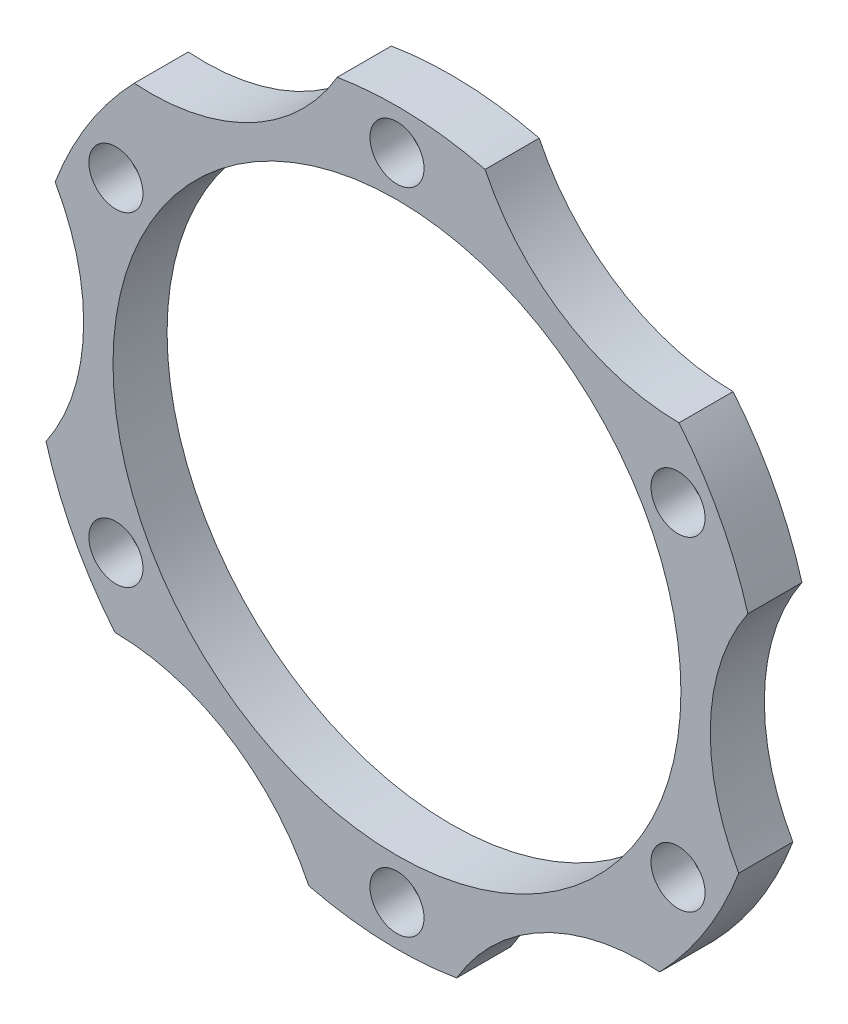
ISO-10303-21;
HEADER;
FILE_DESCRIPTION(('STEP AP214'),'2;1');
FILE_NAME('part.step','',(''),(''),'','','');
FILE_SCHEMA(('AUTOMOTIVE_DESIGN { 1 0 10303 214 1 1 1 1 }'));
ENDSEC;
DATA;
#1=APPLICATION_CONTEXT('core data for automotive mechanical design processes');
#2=APPLICATION_PROTOCOL_DEFINITION('international standard','automotive_design',2000,#1);
#3=PRODUCT_CONTEXT('',#1,'mechanical');
#4=PRODUCT('Part','Part','',(#3));
#5=PRODUCT_RELATED_PRODUCT_CATEGORY('part','',(#4));
#6=PRODUCT_DEFINITION_FORMATION('','',#4);
#7=PRODUCT_DEFINITION_CONTEXT('part definition',#1,'design');
#8=PRODUCT_DEFINITION('design','',#6,#7);
#9=PRODUCT_DEFINITION_SHAPE('','',#8);
#10=(LENGTH_UNIT() NAMED_UNIT(*) SI_UNIT(.MILLI.,.METRE.));
#11=(NAMED_UNIT(*) PLANE_ANGLE_UNIT() SI_UNIT($,.RADIAN.));
#12=(NAMED_UNIT(*) SI_UNIT($,.STERADIAN.) SOLID_ANGLE_UNIT());
#13=UNCERTAINTY_MEASURE_WITH_UNIT(LENGTH_MEASURE(1.E-05),#10,'distance_accuracy_value','');
#14=(GEOMETRIC_REPRESENTATION_CONTEXT(3) GLOBAL_UNCERTAINTY_ASSIGNED_CONTEXT((#13)) GLOBAL_UNIT_ASSIGNED_CONTEXT((#10,
#11,#12)) REPRESENTATION_CONTEXT('',''));
#15=CARTESIAN_POINT('',(0.,0.,0.));
#16=DIRECTION('',(0.,0.,1.));
#17=DIRECTION('',(1.,0.,0.));
#18=AXIS2_PLACEMENT_3D('',#15,#16,#17);
#19=CARTESIAN_POINT('',(0.,60.,10.));
#20=DIRECTION('',(0.,0.,-1.));
#21=DIRECTION('',(-1.,0.,0.));
#22=AXIS2_PLACEMENT_3D('',#19,#20,#21);
#23=CYLINDRICAL_SURFACE('',#22,2.75);
#24=CARTESIAN_POINT('',(0.,60.,0.));
#25=DIRECTION('',(0.,0.,1.));
#26=DIRECTION('',(1.,0.,0.));
#27=AXIS2_PLACEMENT_3D('',#24,#25,#26);
#28=CIRCLE('',#27,2.75);
#29=CARTESIAN_POINT('',(2.75,60.,0.));
#30=VERTEX_POINT('',#29);
#31=EDGE_CURVE('E186',#30,#30,#28,.T.);
#32=ORIENTED_EDGE('',*,*,#31,.F.);
#33=EDGE_LOOP('',(#32));
#34=FACE_BOUND('',#33,.T.);
#35=CARTESIAN_POINT('',(0.,60.,3.));
#36=DIRECTION('',(0.,0.,1.));
#37=DIRECTION('',(1.,0.,0.));
#38=AXIS2_PLACEMENT_3D('',#35,#36,#37);
#39=CIRCLE('',#38,2.75);
#40=CARTESIAN_POINT('',(2.75,60.,3.));
#41=VERTEX_POINT('',#40);
#42=EDGE_CURVE('E51',#41,#41,#39,.T.);
#43=ORIENTED_EDGE('',*,*,#42,.T.);
#44=EDGE_LOOP('',(#43));
#45=FACE_BOUND('',#44,.T.);
#46=ADVANCED_FACE('F47',(#34,#45),#23,.F.);
#47=CARTESIAN_POINT('',(51.9615242270676,30.0000000000022,10.));
#48=DIRECTION('',(0.,0.,-1.));
#49=DIRECTION('',(-1.,0.,0.));
#50=AXIS2_PLACEMENT_3D('',#47,#48,#49);
#51=CYLINDRICAL_SURFACE('',#50,2.75000000000072);
#52=CARTESIAN_POINT('',(51.9615242270676,30.0000000000022,0.));
#53=DIRECTION('',(0.,0.,1.));
#54=DIRECTION('',(1.,0.,0.));
#55=AXIS2_PLACEMENT_3D('',#52,#53,#54);
#56=CIRCLE('',#55,2.75000000000072);
#57=CARTESIAN_POINT('',(54.7115242270683,30.0000000000022,0.));
#58=VERTEX_POINT('',#57);
#59=EDGE_CURVE('E191',#58,#58,#56,.T.);
#60=ORIENTED_EDGE('',*,*,#59,.F.);
#61=EDGE_LOOP('',(#60));
#62=FACE_BOUND('',#61,.T.);
#63=CARTESIAN_POINT('',(51.9615242270676,30.0000000000022,3.));
#64=DIRECTION('',(0.,0.,1.));
#65=DIRECTION('',(1.,0.,0.));
#66=AXIS2_PLACEMENT_3D('',#63,#64,#65);
#67=CIRCLE('',#66,2.75000000000072);
#68=CARTESIAN_POINT('',(54.7115242270683,30.0000000000022,3.));
#69=VERTEX_POINT('',#68);
#70=EDGE_CURVE('E276',#69,#69,#67,.T.);
#71=ORIENTED_EDGE('',*,*,#70,.T.);
#72=EDGE_LOOP('',(#71));
#73=FACE_BOUND('',#72,.T.);
#74=ADVANCED_FACE('F295',(#62,#73),#51,.F.);
#75=CARTESIAN_POINT('',(51.9615242270702,-29.9999999999978,10.));
#76=DIRECTION('',(0.,0.,-1.));
#77=DIRECTION('',(-1.,0.,0.));
#78=AXIS2_PLACEMENT_3D('',#75,#76,#77);
#79=CYLINDRICAL_SURFACE('',#78,2.7500000000033);
#80=CARTESIAN_POINT('',(51.9615242270702,-29.9999999999978,0.));
#81=DIRECTION('',(0.,0.,1.));
#82=DIRECTION('',(1.,0.,0.));
#83=AXIS2_PLACEMENT_3D('',#80,#81,#82);
#84=CIRCLE('',#83,2.7500000000033);
#85=CARTESIAN_POINT('',(54.7115242270734,-29.9999999999978,0.));
#86=VERTEX_POINT('',#85);
#87=EDGE_CURVE('E194',#86,#86,#84,.T.);
#88=ORIENTED_EDGE('',*,*,#87,.F.);
#89=EDGE_LOOP('',(#88));
#90=FACE_BOUND('',#89,.T.);
#91=CARTESIAN_POINT('',(51.9615242270702,-29.9999999999978,3.));
#92=DIRECTION('',(0.,0.,1.));
#93=DIRECTION('',(1.,0.,0.));
#94=AXIS2_PLACEMENT_3D('',#91,#92,#93);
#95=CIRCLE('',#94,2.7500000000033);
#96=CARTESIAN_POINT('',(54.7115242270734,-29.9999999999978,3.));
#97=VERTEX_POINT('',#96);
#98=EDGE_CURVE('E274',#97,#97,#95,.T.);
#99=ORIENTED_EDGE('',*,*,#98,.T.);
#100=EDGE_LOOP('',(#99));
#101=FACE_BOUND('',#100,.T.);
#102=ADVANCED_FACE('F301',(#90,#101),#79,.F.);
#103=CARTESIAN_POINT('',(5.10121193588295E-12,-60.,10.));
#104=DIRECTION('',(0.,0.,-1.));
#105=DIRECTION('',(-1.,0.,0.));
#106=AXIS2_PLACEMENT_3D('',#103,#104,#105);
#107=CYLINDRICAL_SURFACE('',#106,2.75000000000528);
#108=CARTESIAN_POINT('',(5.10121193588295E-12,-60.,0.));
#109=DIRECTION('',(0.,0.,1.));
#110=DIRECTION('',(1.,0.,0.));
#111=AXIS2_PLACEMENT_3D('',#108,#109,#110);
#112=CIRCLE('',#111,2.75000000000528);
#113=CARTESIAN_POINT('',(2.75000000001038,-60.,0.));
#114=VERTEX_POINT('',#113);
#115=EDGE_CURVE('E197',#114,#114,#112,.T.);
#116=ORIENTED_EDGE('',*,*,#115,.F.);
#117=EDGE_LOOP('',(#116));
#118=FACE_BOUND('',#117,.T.);
#119=CARTESIAN_POINT('',(5.10121193588295E-12,-60.,3.));
#120=DIRECTION('',(0.,0.,1.));
#121=DIRECTION('',(1.,0.,0.));
#122=AXIS2_PLACEMENT_3D('',#119,#120,#121);
#123=CIRCLE('',#122,2.75000000000528);
#124=CARTESIAN_POINT('',(2.75000000001038,-60.,3.));
#125=VERTEX_POINT('',#124);
#126=EDGE_CURVE('E268',#125,#125,#123,.T.);
#127=ORIENTED_EDGE('',*,*,#126,.T.);
#128=EDGE_LOOP('',(#127));
#129=FACE_BOUND('',#128,.T.);
#130=ADVANCED_FACE('F411',(#118,#129),#107,.F.);
#131=CARTESIAN_POINT('',(-51.9615242270625,-30.0000000000022,10.));
#132=DIRECTION('',(0.,0.,-1.));
#133=DIRECTION('',(-1.,0.,0.));
#134=AXIS2_PLACEMENT_3D('',#131,#132,#133);
#135=CYLINDRICAL_SURFACE('',#134,2.75000000000488);
#136=CARTESIAN_POINT('',(-51.9615242270625,-30.0000000000022,0.));
#137=DIRECTION('',(0.,0.,1.));
#138=DIRECTION('',(1.,0.,0.));
#139=AXIS2_PLACEMENT_3D('',#136,#137,#138);
#140=CIRCLE('',#139,2.75000000000488);
#141=CARTESIAN_POINT('',(-49.2115242270576,-30.0000000000022,0.));
#142=VERTEX_POINT('',#141);
#143=EDGE_CURVE('E200',#142,#142,#140,.T.);
#144=ORIENTED_EDGE('',*,*,#143,.F.);
#145=EDGE_LOOP('',(#144));
#146=FACE_BOUND('',#145,.T.);
#147=CARTESIAN_POINT('',(-51.9615242270625,-30.0000000000022,3.));
#148=DIRECTION('',(0.,0.,1.));
#149=DIRECTION('',(1.,0.,0.));
#150=AXIS2_PLACEMENT_3D('',#147,#148,#149);
#151=CIRCLE('',#150,2.75000000000488);
#152=CARTESIAN_POINT('',(-49.2115242270576,-30.0000000000022,3.));
#153=VERTEX_POINT('',#152);
#154=EDGE_CURVE('E263',#153,#153,#151,.T.);
#155=ORIENTED_EDGE('',*,*,#154,.T.);
#156=EDGE_LOOP('',(#155));
#157=FACE_BOUND('',#156,.T.);
#158=ADVANCED_FACE('F407',(#146,#157),#135,.F.);
#159=CARTESIAN_POINT('',(-51.9615242270651,29.9999999999978,10.));
#160=DIRECTION('',(0.,0.,-1.));
#161=DIRECTION('',(-1.,0.,0.));
#162=AXIS2_PLACEMENT_3D('',#159,#160,#161);
#163=CYLINDRICAL_SURFACE('',#162,2.75000000000258);
#164=CARTESIAN_POINT('',(-51.9615242270651,29.9999999999978,0.));
#165=DIRECTION('',(0.,0.,1.));
#166=DIRECTION('',(1.,0.,0.));
#167=AXIS2_PLACEMENT_3D('',#164,#165,#166);
#168=CIRCLE('',#167,2.75000000000258);
#169=CARTESIAN_POINT('',(-49.2115242270625,29.9999999999978,0.));
#170=VERTEX_POINT('',#169);
#171=EDGE_CURVE('E203',#170,#170,#168,.T.);
#172=ORIENTED_EDGE('',*,*,#171,.F.);
#173=EDGE_LOOP('',(#172));
#174=FACE_BOUND('',#173,.T.);
#175=CARTESIAN_POINT('',(-51.9615242270651,29.9999999999978,3.));
#176=DIRECTION('',(0.,0.,1.));
#177=DIRECTION('',(1.,0.,0.));
#178=AXIS2_PLACEMENT_3D('',#175,#176,#177);
#179=CIRCLE('',#178,2.75000000000258);
#180=CARTESIAN_POINT('',(-49.2115242270625,29.9999999999978,3.));
#181=VERTEX_POINT('',#180);
#182=EDGE_CURVE('E259',#181,#181,#179,.T.);
#183=ORIENTED_EDGE('',*,*,#182,.T.);
#184=EDGE_LOOP('',(#183));
#185=FACE_BOUND('',#184,.T.);
#186=ADVANCED_FACE('F323',(#174,#185),#163,.F.);
#187=CARTESIAN_POINT('',(0.,0.,10.));
#188=DIRECTION('',(0.,0.,-1.));
#189=DIRECTION('',(-1.,0.,0.));
#190=AXIS2_PLACEMENT_3D('',#187,#188,#189);
#191=CYLINDRICAL_SURFACE('',#190,67.5);
#192=CARTESIAN_POINT('',(0.,0.,0.));
#193=DIRECTION('',(0.,0.,1.));
#194=DIRECTION('',(1.,0.,0.));
#195=AXIS2_PLACEMENT_3D('',#192,#193,#194);
#196=CIRCLE('',#195,67.5);
#197=CARTESIAN_POINT('',(48.5802966191202,-46.8636829581105,0.));
#198=VERTEX_POINT('',#197);
#199=CARTESIAN_POINT('',(63.1891923897818,-23.7355422336871,0.));
#200=VERTEX_POINT('',#199);
#201=EDGE_CURVE('E166',#198,#200,#196,.T.);
#202=ORIENTED_EDGE('',*,*,#201,.T.);
#203=DIRECTION('',(0.,0.,-1.));
#204=VECTOR('',#203,1.);
#205=CARTESIAN_POINT('',(63.1891923897818,-23.7355422336871,7.));
#206=LINE('',#205,#204);
#207=CARTESIAN_POINT('',(63.1891923897818,-23.7355422336871,10.));
#208=VERTEX_POINT('',#207);
#209=EDGE_CURVE('E13',#200,#208,#206,.F.);
#210=ORIENTED_EDGE('',*,*,#209,.T.);
#211=CARTESIAN_POINT('',(0.,0.,10.));
#212=DIRECTION('',(0.,0.,1.));
#213=DIRECTION('',(1.,0.,0.));
#214=AXIS2_PLACEMENT_3D('',#211,#212,#213);
#215=CIRCLE('',#214,67.5);
#216=CARTESIAN_POINT('',(48.5802966191203,-46.8636829581105,10.));
#217=VERTEX_POINT('',#216);
#218=EDGE_CURVE('E164',#217,#208,#215,.T.);
#219=ORIENTED_EDGE('',*,*,#218,.F.);
#220=DIRECTION('',(0.,0.,-1.));
#221=VECTOR('',#220,1.);
#222=CARTESIAN_POINT('',(48.5802966191202,-46.8636829581105,7.));
#223=LINE('',#222,#221);
#224=EDGE_CURVE('E352',#217,#198,#223,.T.);
#225=ORIENTED_EDGE('',*,*,#224,.T.);
#226=EDGE_LOOP('',(#202,#210,#219,#225));
#227=FACE_BOUND('',#226,.T.);
#228=ADVANCED_FACE('F318',(#227),#191,.T.);
#229=CARTESIAN_POINT('',(-16.294991647068,-65.5036124745955,0.));
#230=VERTEX_POINT('',#229);
#231=CARTESIAN_POINT('',(11.0390136479183,-66.5912169710171,0.));
#232=VERTEX_POINT('',#231);
#233=EDGE_CURVE('E174',#230,#232,#196,.T.);
#234=ORIENTED_EDGE('',*,*,#233,.T.);
#235=DIRECTION('',(0.,0.,-1.));
#236=VECTOR('',#235,1.);
#237=CARTESIAN_POINT('',(11.0390136479183,-66.5912169710171,7.));
#238=LINE('',#237,#236);
#239=CARTESIAN_POINT('',(11.0390136479183,-66.5912169710171,10.));
#240=VERTEX_POINT('',#239);
#241=EDGE_CURVE('E354',#232,#240,#238,.F.);
#242=ORIENTED_EDGE('',*,*,#241,.T.);
#243=CARTESIAN_POINT('',(-16.294991647068,-65.5036124745955,10.));
#244=VERTEX_POINT('',#243);
#245=EDGE_CURVE('E168',#244,#240,#215,.T.);
#246=ORIENTED_EDGE('',*,*,#245,.F.);
#247=DIRECTION('',(0.,0.,-1.));
#248=VECTOR('',#247,1.);
#249=CARTESIAN_POINT('',(-16.294991647068,-65.5036124745955,7.));
#250=LINE('',#249,#248);
#251=EDGE_CURVE('E347',#244,#230,#250,.T.);
#252=ORIENTED_EDGE('',*,*,#251,.T.);
#253=EDGE_LOOP('',(#234,#242,#246,#252));
#254=FACE_BOUND('',#253,.T.);
#255=ADVANCED_FACE('F322',(#254),#191,.T.);
#256=CARTESIAN_POINT('',(-64.8752882661852,-18.6399295164809,0.));
#257=VERTEX_POINT('',#256);
#258=CARTESIAN_POINT('',(-52.1501787418607,-42.8556747373318,0.));
#259=VERTEX_POINT('',#258);
#260=EDGE_CURVE('E179',#257,#259,#196,.T.);
#261=ORIENTED_EDGE('',*,*,#260,.T.);
#262=DIRECTION('',(0.,0.,-1.));
#263=VECTOR('',#262,1.);
#264=CARTESIAN_POINT('',(-52.1501787418607,-42.8556747373318,7.));
#265=LINE('',#264,#263);
#266=CARTESIAN_POINT('',(-52.1501787418607,-42.8556747373318,10.));
#267=VERTEX_POINT('',#266);
#268=EDGE_CURVE('E349',#259,#267,#265,.F.);
#269=ORIENTED_EDGE('',*,*,#268,.T.);
#270=CARTESIAN_POINT('',(-64.8752882661852,-18.6399295164809,10.));
#271=VERTEX_POINT('',#270);
#272=EDGE_CURVE('E367',#271,#267,#215,.T.);
#273=ORIENTED_EDGE('',*,*,#272,.F.);
#274=DIRECTION('',(0.,0.,-1.));
#275=VECTOR('',#274,1.);
#276=CARTESIAN_POINT('',(-64.8752882661852,-18.6399295164809,7.));
#277=LINE('',#276,#275);
#278=EDGE_CURVE('E341',#271,#257,#277,.T.);
#279=ORIENTED_EDGE('',*,*,#278,.T.);
#280=EDGE_LOOP('',(#261,#269,#273,#279));
#281=FACE_BOUND('',#280,.T.);
#282=ADVANCED_FACE('F330',(#281),#191,.T.);
#283=CARTESIAN_POINT('',(-48.5802966191192,46.8636829581116,0.));
#284=VERTEX_POINT('',#283);
#285=CARTESIAN_POINT('',(-63.1891923897844,23.7355422336801,0.));
#286=VERTEX_POINT('',#285);
#287=EDGE_CURVE('E171',#284,#286,#196,.T.);
#288=ORIENTED_EDGE('',*,*,#287,.T.);
#289=DIRECTION('',(0.,0.,-1.));
#290=VECTOR('',#289,1.);
#291=CARTESIAN_POINT('',(-63.1891923897844,23.7355422336801,7.));
#292=LINE('',#291,#290);
#293=CARTESIAN_POINT('',(-63.1891923897844,23.7355422336801,10.));
#294=VERTEX_POINT('',#293);
#295=EDGE_CURVE('E344',#286,#294,#292,.F.);
#296=ORIENTED_EDGE('',*,*,#295,.T.);
#297=CARTESIAN_POINT('',(-48.5802966191192,46.8636829581116,10.));
#298=VERTEX_POINT('',#297);
#299=EDGE_CURVE('E368',#298,#294,#215,.T.);
#300=ORIENTED_EDGE('',*,*,#299,.F.);
#301=DIRECTION('',(0.,0.,-1.));
#302=VECTOR('',#301,1.);
#303=CARTESIAN_POINT('',(-48.5802966191192,46.8636829581116,7.));
#304=LINE('',#303,#302);
#305=EDGE_CURVE('E148',#298,#284,#304,.T.);
#306=ORIENTED_EDGE('',*,*,#305,.T.);
#307=EDGE_LOOP('',(#288,#296,#300,#306));
#308=FACE_BOUND('',#307,.T.);
#309=ADVANCED_FACE('F325',(#308),#191,.T.);
#310=CARTESIAN_POINT('',(16.2949916470603,65.5036124745974,0.));
#311=VERTEX_POINT('',#310);
#312=CARTESIAN_POINT('',(-11.0390136479279,66.5912169710155,0.));
#313=VERTEX_POINT('',#312);
#314=EDGE_CURVE('E160',#311,#313,#196,.T.);
#315=ORIENTED_EDGE('',*,*,#314,.T.);
#316=DIRECTION('',(0.,0.,-1.));
#317=VECTOR('',#316,1.);
#318=CARTESIAN_POINT('',(-11.0390136479279,66.5912169710155,7.));
#319=LINE('',#318,#317);
#320=CARTESIAN_POINT('',(-11.0390136479279,66.5912169710155,10.));
#321=VERTEX_POINT('',#320);
#322=EDGE_CURVE('E334',#313,#321,#319,.F.);
#323=ORIENTED_EDGE('',*,*,#322,.T.);
#324=CARTESIAN_POINT('',(16.2949916470603,65.5036124745974,10.));
#325=VERTEX_POINT('',#324);
#326=EDGE_CURVE('E336',#325,#321,#215,.T.);
#327=ORIENTED_EDGE('',*,*,#326,.F.);
#328=DIRECTION('',(0.,0.,-1.));
#329=VECTOR('',#328,1.);
#330=CARTESIAN_POINT('',(16.2949916470603,65.5036124745974,7.));
#331=LINE('',#330,#329);
#332=EDGE_CURVE('E149',#325,#311,#331,.T.);
#333=ORIENTED_EDGE('',*,*,#332,.T.);
#334=EDGE_LOOP('',(#315,#323,#327,#333));
#335=FACE_BOUND('',#334,.T.);
#336=ADVANCED_FACE('F312',(#335),#191,.T.);
#337=CARTESIAN_POINT('',(0.,0.,10.));
#338=DIRECTION('',(0.,0.,1.));
#339=DIRECTION('',(1.,0.,0.));
#340=AXIS2_PLACEMENT_3D('',#337,#338,#339);
#341=PLANE('',#340);
#342=CARTESIAN_POINT('',(0.,60.,10.));
#343=DIRECTION('',(0.,0.,1.));
#344=DIRECTION('',(1.,0.,0.));
#345=AXIS2_PLACEMENT_3D('',#342,#343,#344);
#346=CIRCLE('',#345,5.);
#347=CARTESIAN_POINT('',(5.,60.,10.));
#348=VERTEX_POINT('',#347);
#349=EDGE_CURVE('E249',#348,#348,#346,.T.);
#350=ORIENTED_EDGE('',*,*,#349,.F.);
#351=EDGE_LOOP('',(#350));
#352=FACE_BOUND('',#351,.T.);
#353=CARTESIAN_POINT('',(-51.9615242270651,29.9999999999978,10.));
#354=DIRECTION('',(0.,0.,1.));
#355=DIRECTION('',(1.,0.,0.));
#356=AXIS2_PLACEMENT_3D('',#353,#354,#355);
#357=CIRCLE('',#356,5.00000000000258);
#358=CARTESIAN_POINT('',(-46.9615242270625,29.9999999999978,10.));
#359=VERTEX_POINT('',#358);
#360=EDGE_CURVE('E250',#359,#359,#357,.T.);
#361=ORIENTED_EDGE('',*,*,#360,.F.);
#362=EDGE_LOOP('',(#361));
#363=FACE_BOUND('',#362,.T.);
#364=CARTESIAN_POINT('',(-51.9615242270625,-30.0000000000022,10.));
#365=DIRECTION('',(0.,0.,1.));
#366=DIRECTION('',(1.,0.,0.));
#367=AXIS2_PLACEMENT_3D('',#364,#365,#366);
#368=CIRCLE('',#367,5.00000000000487);
#369=CARTESIAN_POINT('',(-46.9615242270576,-30.0000000000022,10.));
#370=VERTEX_POINT('',#369);
#371=EDGE_CURVE('E224',#370,#370,#368,.T.);
#372=ORIENTED_EDGE('',*,*,#371,.F.);
#373=EDGE_LOOP('',(#372));
#374=FACE_BOUND('',#373,.T.);
#375=CARTESIAN_POINT('',(5.10121193588295E-12,-60.,10.));
#376=DIRECTION('',(0.,0.,1.));
#377=DIRECTION('',(1.,0.,0.));
#378=AXIS2_PLACEMENT_3D('',#375,#376,#377);
#379=CIRCLE('',#378,5.00000000000528);
#380=CARTESIAN_POINT('',(5.00000000001038,-60.,10.));
#381=VERTEX_POINT('',#380);
#382=EDGE_CURVE('E231',#381,#381,#379,.T.);
#383=ORIENTED_EDGE('',*,*,#382,.F.);
#384=EDGE_LOOP('',(#383));
#385=FACE_BOUND('',#384,.T.);
#386=CARTESIAN_POINT('',(51.9615242270702,-29.9999999999978,10.));
#387=DIRECTION('',(0.,0.,1.));
#388=DIRECTION('',(1.,0.,0.));
#389=AXIS2_PLACEMENT_3D('',#386,#387,#388);
#390=CIRCLE('',#389,5.00000000000329);
#391=CARTESIAN_POINT('',(56.9615242270734,-29.9999999999978,10.));
#392=VERTEX_POINT('',#391);
#393=EDGE_CURVE('E237',#392,#392,#390,.T.);
#394=ORIENTED_EDGE('',*,*,#393,.F.);
#395=EDGE_LOOP('',(#394));
#396=FACE_BOUND('',#395,.T.);
#397=CARTESIAN_POINT('',(51.9615242270676,30.0000000000022,10.));
#398=DIRECTION('',(0.,0.,1.));
#399=DIRECTION('',(1.,0.,0.));
#400=AXIS2_PLACEMENT_3D('',#397,#398,#399);
#401=CIRCLE('',#400,5.00000000000072);
#402=CARTESIAN_POINT('',(56.9615242270683,30.0000000000022,10.));
#403=VERTEX_POINT('',#402);
#404=EDGE_CURVE('E243',#403,#403,#401,.T.);
#405=ORIENTED_EDGE('',*,*,#404,.F.);
#406=EDGE_LOOP('',(#405));
#407=FACE_BOUND('',#406,.T.);
#408=CARTESIAN_POINT('',(97.9225152540647,-3.89628108803256,10.));
#409=DIRECTION('',(0.,0.,1.));
#410=DIRECTION('',(1.,0.,0.));
#411=AXIS2_PLACEMENT_3D('',#408,#409,#410);
#412=CIRCLE('',#411,40.);
#413=CARTESIAN_POINT('',(64.8752882661826,18.63992951649,10.));
#414=VERTEX_POINT('',#413);
#415=EDGE_CURVE('E206',#414,#208,#412,.T.);
#416=ORIENTED_EDGE('',*,*,#415,.F.);
#417=CARTESIAN_POINT('',(52.1501787418592,42.8556747373336,10.));
#418=VERTEX_POINT('',#417);
#419=EDGE_CURVE('E170',#414,#418,#215,.T.);
#420=ORIENTED_EDGE('',*,*,#419,.T.);
#421=CARTESIAN_POINT('',(52.3355360295522,82.8552452684768,10.));
#422=DIRECTION('',(0.,0.,1.));
#423=DIRECTION('',(1.,0.,0.));
#424=AXIS2_PLACEMENT_3D('',#421,#422,#423);
#425=CIRCLE('',#424,40.);
#426=EDGE_CURVE('E143',#325,#418,#425,.T.);
#427=ORIENTED_EDGE('',*,*,#426,.F.);
#428=ORIENTED_EDGE('',*,*,#326,.T.);
#429=CARTESIAN_POINT('',(-45.5869792245163,86.7515263565102,10.));
#430=DIRECTION('',(0.,0.,1.));
#431=DIRECTION('',(1.,0.,0.));
#432=AXIS2_PLACEMENT_3D('',#429,#430,#431);
#433=CIRCLE('',#432,40.);
#434=EDGE_CURVE('E214',#298,#321,#433,.T.);
#435=ORIENTED_EDGE('',*,*,#434,.F.);
#436=ORIENTED_EDGE('',*,*,#299,.T.);
#437=CARTESIAN_POINT('',(-97.9225152540724,3.89628108803428,10.));
#438=DIRECTION('',(0.,0.,1.));
#439=DIRECTION('',(1.,0.,0.));
#440=AXIS2_PLACEMENT_3D('',#437,#438,#439);
#441=CIRCLE('',#440,40.);
#442=EDGE_CURVE('E212',#271,#294,#441,.T.);
#443=ORIENTED_EDGE('',*,*,#442,.F.);
#444=ORIENTED_EDGE('',*,*,#272,.T.);
#445=CARTESIAN_POINT('',(-52.3355360295599,-82.855245268475,10.));
#446=DIRECTION('',(0.,0.,1.));
#447=DIRECTION('',(1.,0.,0.));
#448=AXIS2_PLACEMENT_3D('',#445,#446,#447);
#449=CIRCLE('',#448,40.);
#450=EDGE_CURVE('E210',#244,#267,#449,.T.);
#451=ORIENTED_EDGE('',*,*,#450,.F.);
#452=ORIENTED_EDGE('',*,*,#245,.T.);
#453=CARTESIAN_POINT('',(45.5869792245086,-86.7515263565084,10.));
#454=DIRECTION('',(0.,0.,1.));
#455=DIRECTION('',(1.,0.,0.));
#456=AXIS2_PLACEMENT_3D('',#453,#454,#455);
#457=CIRCLE('',#456,40.);
#458=EDGE_CURVE('E208',#217,#240,#457,.T.);
#459=ORIENTED_EDGE('',*,*,#458,.F.);
#460=ORIENTED_EDGE('',*,*,#218,.T.);
#461=EDGE_LOOP('',(#416,#420,#427,#428,#435,#436,#443,#444,#451,#452,#459,#460));
#462=FACE_BOUND('',#461,.T.);
#463=CARTESIAN_POINT('',(0.,0.,10.));
#464=DIRECTION('',(0.,0.,1.));
#465=DIRECTION('',(1.,0.,0.));
#466=AXIS2_PLACEMENT_3D('',#463,#464,#465);
#467=CIRCLE('',#466,52.5);
#468=CARTESIAN_POINT('',(52.5,0.,10.));
#469=VERTEX_POINT('',#468);
#470=EDGE_CURVE('E175',#469,#469,#467,.T.);
#471=ORIENTED_EDGE('',*,*,#470,.F.);
#472=EDGE_LOOP('',(#471));
#473=FACE_BOUND('',#472,.T.);
#474=ADVANCED_FACE('F310',(#352,#363,#374,#385,#396,#407,#462,#473),#341,.T.);
#475=CARTESIAN_POINT('',(0.,0.,0.));
#476=DIRECTION('',(0.,0.,1.));
#477=DIRECTION('',(1.,0.,0.));
#478=AXIS2_PLACEMENT_3D('',#475,#476,#477);
#479=PLANE('',#478);
#480=CARTESIAN_POINT('',(64.8752882661826,18.63992951649,0.));
#481=VERTEX_POINT('',#480);
#482=CARTESIAN_POINT('',(52.1501787418593,42.8556747373336,0.));
#483=VERTEX_POINT('',#482);
#484=EDGE_CURVE('E157',#481,#483,#196,.T.);
#485=ORIENTED_EDGE('',*,*,#484,.F.);
#486=CARTESIAN_POINT('',(97.9225152540647,-3.89628108803256,0.));
#487=DIRECTION('',(0.,0.,-1.));
#488=DIRECTION('',(1.,0.,0.));
#489=AXIS2_PLACEMENT_3D('',#486,#487,#488);
#490=CIRCLE('',#489,40.);
#491=EDGE_CURVE('E217',#200,#481,#490,.T.);
#492=ORIENTED_EDGE('',*,*,#491,.F.);
#493=ORIENTED_EDGE('',*,*,#201,.F.);
#494=CARTESIAN_POINT('',(45.5869792245086,-86.7515263565084,0.));
#495=DIRECTION('',(0.,0.,-1.));
#496=DIRECTION('',(1.,0.,0.));
#497=AXIS2_PLACEMENT_3D('',#494,#495,#496);
#498=CIRCLE('',#497,40.);
#499=EDGE_CURVE('E64',#232,#198,#498,.T.);
#500=ORIENTED_EDGE('',*,*,#499,.F.);
#501=ORIENTED_EDGE('',*,*,#233,.F.);
#502=CARTESIAN_POINT('',(-52.3355360295599,-82.855245268475,0.));
#503=DIRECTION('',(0.,0.,-1.));
#504=DIRECTION('',(1.,0.,0.));
#505=AXIS2_PLACEMENT_3D('',#502,#503,#504);
#506=CIRCLE('',#505,40.);
#507=EDGE_CURVE('E72',#259,#230,#506,.T.);
#508=ORIENTED_EDGE('',*,*,#507,.F.);
#509=ORIENTED_EDGE('',*,*,#260,.F.);
#510=CARTESIAN_POINT('',(-97.9225152540724,3.89628108803428,0.));
#511=DIRECTION('',(0.,0.,-1.));
#512=DIRECTION('',(1.,0.,0.));
#513=AXIS2_PLACEMENT_3D('',#510,#511,#512);
#514=CIRCLE('',#513,40.);
#515=EDGE_CURVE('E221',#286,#257,#514,.T.);
#516=ORIENTED_EDGE('',*,*,#515,.F.);
#517=ORIENTED_EDGE('',*,*,#287,.F.);
#518=CARTESIAN_POINT('',(-45.5869792245163,86.7515263565102,0.));
#519=DIRECTION('',(0.,0.,-1.));
#520=DIRECTION('',(1.,0.,0.));
#521=AXIS2_PLACEMENT_3D('',#518,#519,#520);
#522=CIRCLE('',#521,40.);
#523=EDGE_CURVE('E161',#313,#284,#522,.T.);
#524=ORIENTED_EDGE('',*,*,#523,.F.);
#525=ORIENTED_EDGE('',*,*,#314,.F.);
#526=CARTESIAN_POINT('',(52.3355360295522,82.8552452684768,0.));
#527=DIRECTION('',(0.,0.,-1.));
#528=DIRECTION('',(1.,0.,0.));
#529=AXIS2_PLACEMENT_3D('',#526,#527,#528);
#530=CIRCLE('',#529,40.);
#531=EDGE_CURVE('E140',#483,#311,#530,.T.);
#532=ORIENTED_EDGE('',*,*,#531,.F.);
#533=EDGE_LOOP('',(#485,#492,#493,#500,#501,#508,#509,#516,#517,#524,#525,#532));
#534=FACE_BOUND('',#533,.T.);
#535=CARTESIAN_POINT('',(0.,0.,0.));
#536=DIRECTION('',(0.,0.,1.));
#537=DIRECTION('',(1.,0.,0.));
#538=AXIS2_PLACEMENT_3D('',#535,#536,#537);
#539=CIRCLE('',#538,52.5);
#540=CARTESIAN_POINT('',(52.5,0.,0.));
#541=VERTEX_POINT('',#540);
#542=EDGE_CURVE('E181',#541,#541,#539,.T.);
#543=ORIENTED_EDGE('',*,*,#542,.T.);
#544=EDGE_LOOP('',(#543));
#545=FACE_BOUND('',#544,.T.);
#546=ORIENTED_EDGE('',*,*,#31,.T.);
#547=EDGE_LOOP('',(#546));
#548=FACE_BOUND('',#547,.T.);
#549=ORIENTED_EDGE('',*,*,#59,.T.);
#550=EDGE_LOOP('',(#549));
#551=FACE_BOUND('',#550,.T.);
#552=ORIENTED_EDGE('',*,*,#87,.T.);
#553=EDGE_LOOP('',(#552));
#554=FACE_BOUND('',#553,.T.);
#555=ORIENTED_EDGE('',*,*,#115,.T.);
#556=EDGE_LOOP('',(#555));
#557=FACE_BOUND('',#556,.T.);
#558=ORIENTED_EDGE('',*,*,#143,.T.);
#559=EDGE_LOOP('',(#558));
#560=FACE_BOUND('',#559,.T.);
#561=ORIENTED_EDGE('',*,*,#171,.T.);
#562=EDGE_LOOP('',(#561));
#563=FACE_BOUND('',#562,.T.);
#564=ADVANCED_FACE('F154',(#534,#545,#548,#551,#554,#557,#560,#563),#479,.F.);
#565=ORIENTED_EDGE('',*,*,#419,.F.);
#566=DIRECTION('',(0.,0.,-1.));
#567=VECTOR('',#566,1.);
#568=CARTESIAN_POINT('',(64.8752882661826,18.63992951649,7.));
#569=LINE('',#568,#567);
#570=EDGE_CURVE('E56',#414,#481,#569,.T.);
#571=ORIENTED_EDGE('',*,*,#570,.T.);
#572=ORIENTED_EDGE('',*,*,#484,.T.);
#573=DIRECTION('',(0.,0.,-1.));
#574=VECTOR('',#573,1.);
#575=CARTESIAN_POINT('',(52.1501787418592,42.8556747373336,7.));
#576=LINE('',#575,#574);
#577=EDGE_CURVE('E137',#483,#418,#576,.F.);
#578=ORIENTED_EDGE('',*,*,#577,.T.);
#579=EDGE_LOOP('',(#565,#571,#572,#578));
#580=FACE_BOUND('',#579,.T.);
#581=ADVANCED_FACE('F49',(#580),#191,.T.);
#582=CARTESIAN_POINT('',(0.,0.,10.));
#583=DIRECTION('',(0.,0.,-1.));
#584=DIRECTION('',(-1.,0.,0.));
#585=AXIS2_PLACEMENT_3D('',#582,#583,#584);
#586=CYLINDRICAL_SURFACE('',#585,52.5);
#587=ORIENTED_EDGE('',*,*,#470,.T.);
#588=EDGE_LOOP('',(#587));
#589=FACE_BOUND('',#588,.T.);
#590=ORIENTED_EDGE('',*,*,#542,.F.);
#591=EDGE_LOOP('',(#590));
#592=FACE_BOUND('',#591,.T.);
#593=ADVANCED_FACE('F307',(#589,#592),#586,.F.);
#594=CARTESIAN_POINT('',(52.3355360295522,82.8552452684768,14.));
#595=DIRECTION('',(0.,0.,-1.));
#596=DIRECTION('',(-1.,0.,0.));
#597=AXIS2_PLACEMENT_3D('',#594,#595,#596);
#598=CYLINDRICAL_SURFACE('',#597,40.);
#599=ORIENTED_EDGE('',*,*,#531,.T.);
#600=ORIENTED_EDGE('',*,*,#332,.F.);
#601=ORIENTED_EDGE('',*,*,#426,.T.);
#602=ORIENTED_EDGE('',*,*,#577,.F.);
#603=EDGE_LOOP('',(#599,#600,#601,#602));
#604=FACE_BOUND('',#603,.T.);
#605=ADVANCED_FACE('F139',(#604),#598,.F.);
#606=CARTESIAN_POINT('',(-45.5869792245163,86.7515263565102,14.));
#607=DIRECTION('',(0.,0.,-1.));
#608=DIRECTION('',(-1.,0.,0.));
#609=AXIS2_PLACEMENT_3D('',#606,#607,#608);
#610=CYLINDRICAL_SURFACE('',#609,40.);
#611=ORIENTED_EDGE('',*,*,#523,.T.);
#612=ORIENTED_EDGE('',*,*,#305,.F.);
#613=ORIENTED_EDGE('',*,*,#434,.T.);
#614=ORIENTED_EDGE('',*,*,#322,.F.);
#615=EDGE_LOOP('',(#611,#612,#613,#614));
#616=FACE_BOUND('',#615,.T.);
#617=ADVANCED_FACE('F386',(#616),#610,.F.);
#618=CARTESIAN_POINT('',(-97.9225152540724,3.89628108803428,14.));
#619=DIRECTION('',(0.,0.,-1.));
#620=DIRECTION('',(-1.,0.,0.));
#621=AXIS2_PLACEMENT_3D('',#618,#619,#620);
#622=CYLINDRICAL_SURFACE('',#621,40.);
#623=ORIENTED_EDGE('',*,*,#515,.T.);
#624=ORIENTED_EDGE('',*,*,#278,.F.);
#625=ORIENTED_EDGE('',*,*,#442,.T.);
#626=ORIENTED_EDGE('',*,*,#295,.F.);
#627=EDGE_LOOP('',(#623,#624,#625,#626));
#628=FACE_BOUND('',#627,.T.);
#629=ADVANCED_FACE('F383',(#628),#622,.F.);
#630=CARTESIAN_POINT('',(-52.3355360295599,-82.855245268475,14.));
#631=DIRECTION('',(0.,0.,-1.));
#632=DIRECTION('',(-1.,0.,0.));
#633=AXIS2_PLACEMENT_3D('',#630,#631,#632);
#634=CYLINDRICAL_SURFACE('',#633,40.);
#635=ORIENTED_EDGE('',*,*,#507,.T.);
#636=ORIENTED_EDGE('',*,*,#251,.F.);
#637=ORIENTED_EDGE('',*,*,#450,.T.);
#638=ORIENTED_EDGE('',*,*,#268,.F.);
#639=EDGE_LOOP('',(#635,#636,#637,#638));
#640=FACE_BOUND('',#639,.T.);
#641=ADVANCED_FACE('F385',(#640),#634,.F.);
#642=CARTESIAN_POINT('',(45.5869792245086,-86.7515263565084,14.));
#643=DIRECTION('',(0.,0.,-1.));
#644=DIRECTION('',(-1.,0.,0.));
#645=AXIS2_PLACEMENT_3D('',#642,#643,#644);
#646=CYLINDRICAL_SURFACE('',#645,40.);
#647=ORIENTED_EDGE('',*,*,#499,.T.);
#648=ORIENTED_EDGE('',*,*,#224,.F.);
#649=ORIENTED_EDGE('',*,*,#458,.T.);
#650=ORIENTED_EDGE('',*,*,#241,.F.);
#651=EDGE_LOOP('',(#647,#648,#649,#650));
#652=FACE_BOUND('',#651,.T.);
#653=ADVANCED_FACE('F392',(#652),#646,.F.);
#654=CARTESIAN_POINT('',(97.9225152540647,-3.89628108803256,14.));
#655=DIRECTION('',(0.,0.,-1.));
#656=DIRECTION('',(-1.,0.,0.));
#657=AXIS2_PLACEMENT_3D('',#654,#655,#656);
#658=CYLINDRICAL_SURFACE('',#657,40.);
#659=ORIENTED_EDGE('',*,*,#491,.T.);
#660=ORIENTED_EDGE('',*,*,#570,.F.);
#661=ORIENTED_EDGE('',*,*,#415,.T.);
#662=ORIENTED_EDGE('',*,*,#209,.F.);
#663=EDGE_LOOP('',(#659,#660,#661,#662));
#664=FACE_BOUND('',#663,.T.);
#665=ADVANCED_FACE('F375',(#664),#658,.F.);
#666=CARTESIAN_POINT('',(-51.9615242270651,29.9999999999978,3.));
#667=DIRECTION('',(0.,0.,1.));
#668=DIRECTION('',(1.,0.,0.));
#669=AXIS2_PLACEMENT_3D('',#666,#667,#668);
#670=CYLINDRICAL_SURFACE('',#669,5.00000000000258);
#671=CARTESIAN_POINT('',(-51.9615242270651,29.9999999999978,3.));
#672=DIRECTION('',(0.,0.,1.));
#673=DIRECTION('',(1.,0.,0.));
#674=AXIS2_PLACEMENT_3D('',#671,#672,#673);
#675=CIRCLE('',#674,5.00000000000258);
#676=CARTESIAN_POINT('',(-46.9615242270625,29.9999999999978,3.));
#677=VERTEX_POINT('',#676);
#678=EDGE_CURVE('E228',#677,#677,#675,.T.);
#679=ORIENTED_EDGE('',*,*,#678,.F.);
#680=EDGE_LOOP('',(#679));
#681=FACE_BOUND('',#680,.T.);
#682=ORIENTED_EDGE('',*,*,#360,.T.);
#683=EDGE_LOOP('',(#682));
#684=FACE_BOUND('',#683,.T.);
#685=ADVANCED_FACE('F402',(#681,#684),#670,.F.);
#686=CARTESIAN_POINT('',(-51.9615242270651,29.9999999999978,3.));
#687=DIRECTION('',(0.,0.,1.));
#688=DIRECTION('',(1.,0.,0.));
#689=AXIS2_PLACEMENT_3D('',#686,#687,#688);
#690=PLANE('',#689);
#691=ORIENTED_EDGE('',*,*,#182,.F.);
#692=EDGE_LOOP('',(#691));
#693=FACE_BOUND('',#692,.T.);
#694=ORIENTED_EDGE('',*,*,#678,.T.);
#695=EDGE_LOOP('',(#694));
#696=FACE_BOUND('',#695,.T.);
#697=ADVANCED_FACE('F463',(#693,#696),#690,.T.);
#698=CARTESIAN_POINT('',(-51.9615242270625,-30.0000000000022,3.));
#699=DIRECTION('',(0.,0.,1.));
#700=DIRECTION('',(1.,0.,0.));
#701=AXIS2_PLACEMENT_3D('',#698,#699,#700);
#702=CYLINDRICAL_SURFACE('',#701,5.00000000000487);
#703=CARTESIAN_POINT('',(-51.9615242270625,-30.0000000000022,3.));
#704=DIRECTION('',(0.,0.,1.));
#705=DIRECTION('',(1.,0.,0.));
#706=AXIS2_PLACEMENT_3D('',#703,#704,#705);
#707=CIRCLE('',#706,5.00000000000487);
#708=CARTESIAN_POINT('',(-46.9615242270576,-30.0000000000022,3.));
#709=VERTEX_POINT('',#708);
#710=EDGE_CURVE('E227',#709,#709,#707,.T.);
#711=ORIENTED_EDGE('',*,*,#710,.F.);
#712=EDGE_LOOP('',(#711));
#713=FACE_BOUND('',#712,.T.);
#714=ORIENTED_EDGE('',*,*,#371,.T.);
#715=EDGE_LOOP('',(#714));
#716=FACE_BOUND('',#715,.T.);
#717=ADVANCED_FACE('F460',(#713,#716),#702,.F.);
#718=CARTESIAN_POINT('',(-51.9615242270625,-30.0000000000022,3.));
#719=DIRECTION('',(0.,0.,1.));
#720=DIRECTION('',(1.,0.,0.));
#721=AXIS2_PLACEMENT_3D('',#718,#719,#720);
#722=PLANE('',#721);
#723=ORIENTED_EDGE('',*,*,#154,.F.);
#724=EDGE_LOOP('',(#723));
#725=FACE_BOUND('',#724,.T.);
#726=ORIENTED_EDGE('',*,*,#710,.T.);
#727=EDGE_LOOP('',(#726));
#728=FACE_BOUND('',#727,.T.);
#729=ADVANCED_FACE('F457',(#725,#728),#722,.T.);
#730=CARTESIAN_POINT('',(5.10121193588295E-12,-60.,3.));
#731=DIRECTION('',(0.,0.,1.));
#732=DIRECTION('',(1.,0.,0.));
#733=AXIS2_PLACEMENT_3D('',#730,#731,#732);
#734=CYLINDRICAL_SURFACE('',#733,5.00000000000528);
#735=CARTESIAN_POINT('',(5.10121193588295E-12,-60.,3.));
#736=DIRECTION('',(0.,0.,1.));
#737=DIRECTION('',(1.,0.,0.));
#738=AXIS2_PLACEMENT_3D('',#735,#736,#737);
#739=CIRCLE('',#738,5.00000000000528);
#740=CARTESIAN_POINT('',(5.00000000001038,-60.,3.));
#741=VERTEX_POINT('',#740);
#742=EDGE_CURVE('E234',#741,#741,#739,.T.);
#743=ORIENTED_EDGE('',*,*,#742,.F.);
#744=EDGE_LOOP('',(#743));
#745=FACE_BOUND('',#744,.T.);
#746=ORIENTED_EDGE('',*,*,#382,.T.);
#747=EDGE_LOOP('',(#746));
#748=FACE_BOUND('',#747,.T.);
#749=ADVANCED_FACE('F453',(#745,#748),#734,.F.);
#750=CARTESIAN_POINT('',(5.10121193588295E-12,-60.,3.));
#751=DIRECTION('',(0.,0.,1.));
#752=DIRECTION('',(1.,0.,0.));
#753=AXIS2_PLACEMENT_3D('',#750,#751,#752);
#754=PLANE('',#753);
#755=ORIENTED_EDGE('',*,*,#126,.F.);
#756=EDGE_LOOP('',(#755));
#757=FACE_BOUND('',#756,.T.);
#758=ORIENTED_EDGE('',*,*,#742,.T.);
#759=EDGE_LOOP('',(#758));
#760=FACE_BOUND('',#759,.T.);
#761=ADVANCED_FACE('F433',(#757,#760),#754,.T.);
#762=CARTESIAN_POINT('',(51.9615242270702,-29.9999999999978,3.));
#763=DIRECTION('',(0.,0.,1.));
#764=DIRECTION('',(1.,0.,0.));
#765=AXIS2_PLACEMENT_3D('',#762,#763,#764);
#766=CYLINDRICAL_SURFACE('',#765,5.00000000000329);
#767=CARTESIAN_POINT('',(51.9615242270702,-29.9999999999978,3.));
#768=DIRECTION('',(0.,0.,1.));
#769=DIRECTION('',(1.,0.,0.));
#770=AXIS2_PLACEMENT_3D('',#767,#768,#769);
#771=CIRCLE('',#770,5.00000000000329);
#772=CARTESIAN_POINT('',(56.9615242270734,-29.9999999999978,3.));
#773=VERTEX_POINT('',#772);
#774=EDGE_CURVE('E240',#773,#773,#771,.T.);
#775=ORIENTED_EDGE('',*,*,#774,.F.);
#776=EDGE_LOOP('',(#775));
#777=FACE_BOUND('',#776,.T.);
#778=ORIENTED_EDGE('',*,*,#393,.T.);
#779=EDGE_LOOP('',(#778));
#780=FACE_BOUND('',#779,.T.);
#781=ADVANCED_FACE('F427',(#777,#780),#766,.F.);
#782=CARTESIAN_POINT('',(51.9615242270702,-29.9999999999978,3.));
#783=DIRECTION('',(0.,0.,1.));
#784=DIRECTION('',(1.,0.,0.));
#785=AXIS2_PLACEMENT_3D('',#782,#783,#784);
#786=PLANE('',#785);
#787=ORIENTED_EDGE('',*,*,#98,.F.);
#788=EDGE_LOOP('',(#787));
#789=FACE_BOUND('',#788,.T.);
#790=ORIENTED_EDGE('',*,*,#774,.T.);
#791=EDGE_LOOP('',(#790));
#792=FACE_BOUND('',#791,.T.);
#793=ADVANCED_FACE('F423',(#789,#792),#786,.T.);
#794=CARTESIAN_POINT('',(51.9615242270676,30.0000000000022,3.));
#795=DIRECTION('',(0.,0.,1.));
#796=DIRECTION('',(1.,0.,0.));
#797=AXIS2_PLACEMENT_3D('',#794,#795,#796);
#798=CYLINDRICAL_SURFACE('',#797,5.00000000000072);
#799=CARTESIAN_POINT('',(51.9615242270676,30.0000000000022,3.));
#800=DIRECTION('',(0.,0.,1.));
#801=DIRECTION('',(1.,0.,0.));
#802=AXIS2_PLACEMENT_3D('',#799,#800,#801);
#803=CIRCLE('',#802,5.00000000000072);
#804=CARTESIAN_POINT('',(56.9615242270683,30.0000000000022,3.));
#805=VERTEX_POINT('',#804);
#806=EDGE_CURVE('E246',#805,#805,#803,.T.);
#807=ORIENTED_EDGE('',*,*,#806,.F.);
#808=EDGE_LOOP('',(#807));
#809=FACE_BOUND('',#808,.T.);
#810=ORIENTED_EDGE('',*,*,#404,.T.);
#811=EDGE_LOOP('',(#810));
#812=FACE_BOUND('',#811,.T.);
#813=ADVANCED_FACE('F426',(#809,#812),#798,.F.);
#814=CARTESIAN_POINT('',(51.9615242270676,30.0000000000022,3.));
#815=DIRECTION('',(0.,0.,1.));
#816=DIRECTION('',(1.,0.,0.));
#817=AXIS2_PLACEMENT_3D('',#814,#815,#816);
#818=PLANE('',#817);
#819=ORIENTED_EDGE('',*,*,#70,.F.);
#820=EDGE_LOOP('',(#819));
#821=FACE_BOUND('',#820,.T.);
#822=ORIENTED_EDGE('',*,*,#806,.T.);
#823=EDGE_LOOP('',(#822));
#824=FACE_BOUND('',#823,.T.);
#825=ADVANCED_FACE('F291',(#821,#824),#818,.T.);
#826=CARTESIAN_POINT('',(0.,60.,3.));
#827=DIRECTION('',(0.,0.,1.));
#828=DIRECTION('',(1.,0.,0.));
#829=AXIS2_PLACEMENT_3D('',#826,#827,#828);
#830=CYLINDRICAL_SURFACE('',#829,5.);
#831=CARTESIAN_POINT('',(0.,60.,3.));
#832=DIRECTION('',(0.,0.,1.));
#833=DIRECTION('',(1.,0.,0.));
#834=AXIS2_PLACEMENT_3D('',#831,#832,#833);
#835=CIRCLE('',#834,5.);
#836=CARTESIAN_POINT('',(5.,60.,3.));
#837=VERTEX_POINT('',#836);
#838=EDGE_CURVE('E257',#837,#837,#835,.T.);
#839=ORIENTED_EDGE('',*,*,#838,.F.);
#840=EDGE_LOOP('',(#839));
#841=FACE_BOUND('',#840,.T.);
#842=ORIENTED_EDGE('',*,*,#349,.T.);
#843=EDGE_LOOP('',(#842));
#844=FACE_BOUND('',#843,.T.);
#845=ADVANCED_FACE('F286',(#841,#844),#830,.F.);
#846=CARTESIAN_POINT('',(0.,60.,3.));
#847=DIRECTION('',(0.,0.,1.));
#848=DIRECTION('',(1.,0.,0.));
#849=AXIS2_PLACEMENT_3D('',#846,#847,#848);
#850=PLANE('',#849);
#851=ORIENTED_EDGE('',*,*,#42,.F.);
#852=EDGE_LOOP('',(#851));
#853=FACE_BOUND('',#852,.T.);
#854=ORIENTED_EDGE('',*,*,#838,.T.);
#855=EDGE_LOOP('',(#854));
#856=FACE_BOUND('',#855,.T.);
#857=ADVANCED_FACE('F284',(#853,#856),#850,.T.);
#858=CLOSED_SHELL('',(#46,#74,#102,#130,#158,#186,#228,#255,#282,#309,#336,#474,#564,#581,#593,
#605,#617,#629,#641,#653,#665,#685,#697,#717,#729,#749,#761,#781,#793,#813,#825,#845,#857));
#859=MANIFOLD_SOLID_BREP('B2',#858);
#860=ADVANCED_BREP_SHAPE_REPRESENTATION('',(#18,#859),#14);
#861=SHAPE_DEFINITION_REPRESENTATION(#9,#860);
ENDSEC;
END-ISO-10303-21;
